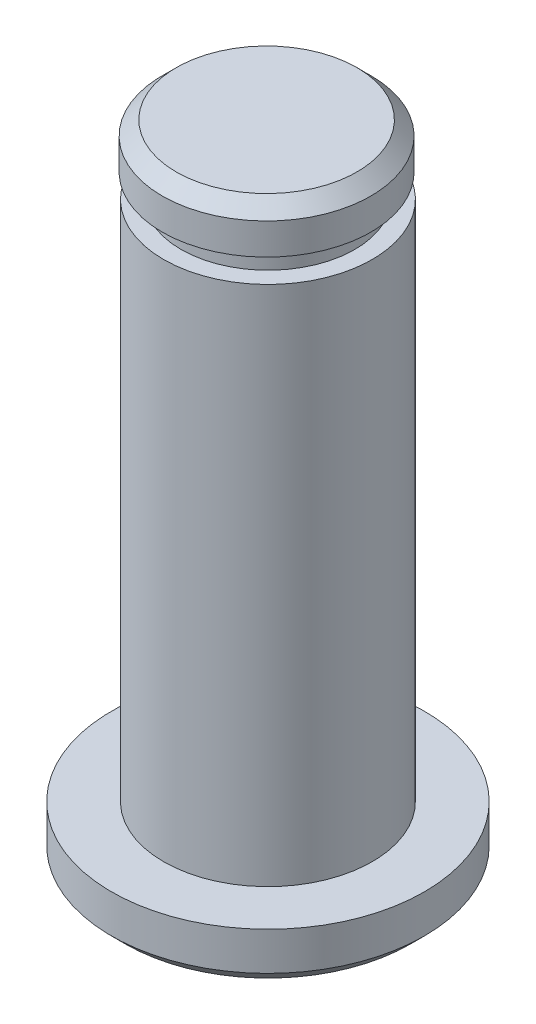
ISO-10303-21;
HEADER;
FILE_DESCRIPTION(('STEP AP214'),'2;1');
FILE_NAME('part.step','',(''),(''),'','','');
FILE_SCHEMA(('AUTOMOTIVE_DESIGN { 1 0 10303 214 1 1 1 1 }'));
ENDSEC;
DATA;
#1=APPLICATION_CONTEXT('core data for automotive mechanical design processes');
#2=APPLICATION_PROTOCOL_DEFINITION('international standard','automotive_design',2000,#1);
#3=PRODUCT_CONTEXT('',#1,'mechanical');
#4=PRODUCT('Part','Part','',(#3));
#5=PRODUCT_RELATED_PRODUCT_CATEGORY('part','',(#4));
#6=PRODUCT_DEFINITION_FORMATION('','',#4);
#7=PRODUCT_DEFINITION_CONTEXT('part definition',#1,'design');
#8=PRODUCT_DEFINITION('design','',#6,#7);
#9=PRODUCT_DEFINITION_SHAPE('','',#8);
#10=(LENGTH_UNIT() NAMED_UNIT(*) SI_UNIT(.MILLI.,.METRE.));
#11=(NAMED_UNIT(*) PLANE_ANGLE_UNIT() SI_UNIT($,.RADIAN.));
#12=(NAMED_UNIT(*) SI_UNIT($,.STERADIAN.) SOLID_ANGLE_UNIT());
#13=UNCERTAINTY_MEASURE_WITH_UNIT(LENGTH_MEASURE(1.E-05),#10,'distance_accuracy_value','');
#14=(GEOMETRIC_REPRESENTATION_CONTEXT(3) GLOBAL_UNCERTAINTY_ASSIGNED_CONTEXT((#13)) GLOBAL_UNIT_ASSIGNED_CONTEXT((#10,
#11,#12)) REPRESENTATION_CONTEXT('',''));
#15=CARTESIAN_POINT('',(0.,0.,0.));
#16=DIRECTION('',(0.,0.,1.));
#17=DIRECTION('',(1.,0.,0.));
#18=AXIS2_PLACEMENT_3D('',#15,#16,#17);
#19=CARTESIAN_POINT('',(0.,18.1,0.038502673796736));
#20=DIRECTION('',(0.,-1.,0.));
#21=DIRECTION('',(0.,0.,1.));
#22=AXIS2_PLACEMENT_3D('',#19,#20,#21);
#23=CONICAL_SURFACE('',#22,3.,0.785398163397447);
#24=CARTESIAN_POINT('',(0.,18.1,0.038502673796736));
#25=DIRECTION('',(0.,1.,0.));
#26=DIRECTION('',(0.,0.,1.));
#27=AXIS2_PLACEMENT_3D('',#24,#25,#26);
#28=CIRCLE('',#27,3.);
#29=CARTESIAN_POINT('',(0.,18.1,3.03850267379674));
#30=VERTEX_POINT('',#29);
#31=EDGE_CURVE('E91',#30,#30,#28,.T.);
#32=ORIENTED_EDGE('',*,*,#31,.T.);
#33=EDGE_LOOP('',(#32));
#34=FACE_BOUND('',#33,.T.);
#35=CARTESIAN_POINT('',(0.,18.5,0.038502673796736));
#36=DIRECTION('',(0.,-1.,0.));
#37=DIRECTION('',(0.,0.,1.));
#38=AXIS2_PLACEMENT_3D('',#35,#36,#37);
#39=CIRCLE('',#38,2.6);
#40=CARTESIAN_POINT('',(0.,18.5,2.63850267379674));
#41=VERTEX_POINT('',#40);
#42=EDGE_CURVE('E11',#41,#41,#39,.T.);
#43=ORIENTED_EDGE('',*,*,#42,.T.);
#44=EDGE_LOOP('',(#43));
#45=FACE_BOUND('',#44,.T.);
#46=ADVANCED_FACE('F41',(#34,#45),#23,.T.);
#47=CARTESIAN_POINT('',(0.,0.4,0.));
#48=DIRECTION('',(0.,1.,0.));
#49=DIRECTION('',(0.,0.,-1.));
#50=AXIS2_PLACEMENT_3D('',#47,#48,#49);
#51=CONICAL_SURFACE('',#50,4.5,0.785398163397449);
#52=CARTESIAN_POINT('',(0.,0.4,0.));
#53=DIRECTION('',(0.,-1.,0.));
#54=DIRECTION('',(0.,0.,-1.));
#55=AXIS2_PLACEMENT_3D('',#52,#53,#54);
#56=CIRCLE('',#55,4.5);
#57=CARTESIAN_POINT('',(0.,0.4,-4.5));
#58=VERTEX_POINT('',#57);
#59=EDGE_CURVE('E99',#58,#58,#56,.T.);
#60=ORIENTED_EDGE('',*,*,#59,.T.);
#61=EDGE_LOOP('',(#60));
#62=FACE_BOUND('',#61,.T.);
#63=CARTESIAN_POINT('',(0.,0.,0.));
#64=DIRECTION('',(0.,1.,0.));
#65=DIRECTION('',(0.,0.,-1.));
#66=AXIS2_PLACEMENT_3D('',#63,#64,#65);
#67=CIRCLE('',#66,4.1);
#68=CARTESIAN_POINT('',(0.,0.,-4.1));
#69=VERTEX_POINT('',#68);
#70=EDGE_CURVE('E76',#69,#69,#67,.T.);
#71=ORIENTED_EDGE('',*,*,#70,.T.);
#72=EDGE_LOOP('',(#71));
#73=FACE_BOUND('',#72,.T.);
#74=ADVANCED_FACE('F124',(#62,#73),#51,.T.);
#75=CARTESIAN_POINT('',(0.,17.2,0.038502673796736));
#76=DIRECTION('',(0.,-1.,0.));
#77=DIRECTION('',(0.,0.,1.));
#78=AXIS2_PLACEMENT_3D('',#75,#76,#77);
#79=PLANE('',#78);
#80=CARTESIAN_POINT('',(0.,17.2,0.038502673796736));
#81=DIRECTION('',(0.,1.,0.));
#82=DIRECTION('',(0.,0.,1.));
#83=AXIS2_PLACEMENT_3D('',#80,#81,#82);
#84=CIRCLE('',#83,3.);
#85=CARTESIAN_POINT('',(0.,17.2,3.03850267379674));
#86=VERTEX_POINT('',#85);
#87=EDGE_CURVE('E50',#86,#86,#84,.T.);
#88=ORIENTED_EDGE('',*,*,#87,.F.);
#89=EDGE_LOOP('',(#88));
#90=FACE_BOUND('',#89,.T.);
#91=CARTESIAN_POINT('',(0.,17.2,0.));
#92=DIRECTION('',(0.,1.,0.));
#93=DIRECTION('',(0.,0.,1.));
#94=AXIS2_PLACEMENT_3D('',#91,#92,#93);
#95=CIRCLE('',#94,2.5);
#96=CARTESIAN_POINT('',(0.,17.2,2.5));
#97=VERTEX_POINT('',#96);
#98=EDGE_CURVE('E87',#97,#97,#95,.T.);
#99=ORIENTED_EDGE('',*,*,#98,.T.);
#100=EDGE_LOOP('',(#99));
#101=FACE_BOUND('',#100,.T.);
#102=ADVANCED_FACE('F128',(#90,#101),#79,.T.);
#103=CARTESIAN_POINT('',(0.,18.5,0.038502673796736));
#104=DIRECTION('',(0.,-1.,0.));
#105=DIRECTION('',(0.,0.,1.));
#106=AXIS2_PLACEMENT_3D('',#103,#104,#105);
#107=PLANE('',#106);
#108=ORIENTED_EDGE('',*,*,#42,.F.);
#109=EDGE_LOOP('',(#108));
#110=FACE_BOUND('',#109,.T.);
#111=ADVANCED_FACE('F134',(#110),#107,.F.);
#112=CARTESIAN_POINT('',(0.,18.5,0.038502673796736));
#113=DIRECTION('',(0.,-1.,0.));
#114=DIRECTION('',(0.,0.,1.));
#115=AXIS2_PLACEMENT_3D('',#112,#113,#114);
#116=CYLINDRICAL_SURFACE('',#115,3.);
#117=ORIENTED_EDGE('',*,*,#87,.T.);
#118=EDGE_LOOP('',(#117));
#119=FACE_BOUND('',#118,.T.);
#120=ORIENTED_EDGE('',*,*,#31,.F.);
#121=EDGE_LOOP('',(#120));
#122=FACE_BOUND('',#121,.T.);
#123=ADVANCED_FACE('F151',(#119,#122),#116,.T.);
#124=CARTESIAN_POINT('',(0.,17.2,0.));
#125=DIRECTION('',(0.,-1.,0.));
#126=DIRECTION('',(0.,0.,1.));
#127=AXIS2_PLACEMENT_3D('',#124,#125,#126);
#128=CYLINDRICAL_SURFACE('',#127,2.5);
#129=CARTESIAN_POINT('',(0.,16.5,0.));
#130=DIRECTION('',(0.,1.,0.));
#131=DIRECTION('',(0.,0.,1.));
#132=AXIS2_PLACEMENT_3D('',#129,#130,#131);
#133=CIRCLE('',#132,2.5);
#134=CARTESIAN_POINT('',(0.,16.5,2.5));
#135=VERTEX_POINT('',#134);
#136=EDGE_CURVE('E44',#135,#135,#133,.T.);
#137=ORIENTED_EDGE('',*,*,#136,.T.);
#138=EDGE_LOOP('',(#137));
#139=FACE_BOUND('',#138,.T.);
#140=ORIENTED_EDGE('',*,*,#98,.F.);
#141=EDGE_LOOP('',(#140));
#142=FACE_BOUND('',#141,.T.);
#143=ADVANCED_FACE('F143',(#139,#142),#128,.T.);
#144=CARTESIAN_POINT('',(0.,16.5,0.));
#145=DIRECTION('',(0.,-1.,0.));
#146=DIRECTION('',(0.,0.,1.));
#147=AXIS2_PLACEMENT_3D('',#144,#145,#146);
#148=PLANE('',#147);
#149=CARTESIAN_POINT('',(0.,16.5,0.));
#150=DIRECTION('',(0.,1.,0.));
#151=DIRECTION('',(0.,0.,1.));
#152=AXIS2_PLACEMENT_3D('',#149,#150,#151);
#153=CIRCLE('',#152,3.);
#154=CARTESIAN_POINT('',(0.,16.5,3.));
#155=VERTEX_POINT('',#154);
#156=EDGE_CURVE('E98',#155,#155,#153,.T.);
#157=ORIENTED_EDGE('',*,*,#156,.T.);
#158=EDGE_LOOP('',(#157));
#159=FACE_BOUND('',#158,.T.);
#160=ORIENTED_EDGE('',*,*,#136,.F.);
#161=EDGE_LOOP('',(#160));
#162=FACE_BOUND('',#161,.T.);
#163=ADVANCED_FACE('F139',(#159,#162),#148,.F.);
#164=CARTESIAN_POINT('',(0.,16.5,0.));
#165=DIRECTION('',(0.,-1.,0.));
#166=DIRECTION('',(0.,0.,1.));
#167=AXIS2_PLACEMENT_3D('',#164,#165,#166);
#168=CYLINDRICAL_SURFACE('',#167,3.);
#169=CARTESIAN_POINT('',(0.,1.5,0.));
#170=DIRECTION('',(0.,1.,0.));
#171=DIRECTION('',(0.,0.,1.));
#172=AXIS2_PLACEMENT_3D('',#169,#170,#171);
#173=CIRCLE('',#172,3.);
#174=CARTESIAN_POINT('',(0.,1.5,3.));
#175=VERTEX_POINT('',#174);
#176=EDGE_CURVE('E70',#175,#175,#173,.T.);
#177=ORIENTED_EDGE('',*,*,#176,.T.);
#178=EDGE_LOOP('',(#177));
#179=FACE_BOUND('',#178,.T.);
#180=ORIENTED_EDGE('',*,*,#156,.F.);
#181=EDGE_LOOP('',(#180));
#182=FACE_BOUND('',#181,.T.);
#183=ADVANCED_FACE('F118',(#179,#182),#168,.T.);
#184=CARTESIAN_POINT('',(0.,0.,0.));
#185=DIRECTION('',(0.,1.,0.));
#186=DIRECTION('',(1.,0.,0.));
#187=AXIS2_PLACEMENT_3D('',#184,#185,#186);
#188=PLANE('',#187);
#189=ORIENTED_EDGE('',*,*,#70,.F.);
#190=EDGE_LOOP('',(#189));
#191=FACE_BOUND('',#190,.T.);
#192=ADVANCED_FACE('F112',(#191),#188,.F.);
#193=CARTESIAN_POINT('',(0.,1.5,0.));
#194=DIRECTION('',(0.,1.,0.));
#195=DIRECTION('',(1.,0.,0.));
#196=AXIS2_PLACEMENT_3D('',#193,#194,#195);
#197=PLANE('',#196);
#198=CARTESIAN_POINT('',(0.,1.5,0.));
#199=DIRECTION('',(0.,-1.,0.));
#200=DIRECTION('',(1.,0.,0.));
#201=AXIS2_PLACEMENT_3D('',#198,#199,#200);
#202=CIRCLE('',#201,4.5);
#203=CARTESIAN_POINT('',(4.5,1.5,0.));
#204=VERTEX_POINT('',#203);
#205=EDGE_CURVE('E101',#204,#204,#202,.T.);
#206=ORIENTED_EDGE('',*,*,#205,.F.);
#207=EDGE_LOOP('',(#206));
#208=FACE_BOUND('',#207,.T.);
#209=ORIENTED_EDGE('',*,*,#176,.F.);
#210=EDGE_LOOP('',(#209));
#211=FACE_BOUND('',#210,.T.);
#212=ADVANCED_FACE('F109',(#208,#211),#197,.T.);
#213=CARTESIAN_POINT('',(0.,1.5,0.));
#214=DIRECTION('',(0.,-1.,0.));
#215=DIRECTION('',(0.,0.,1.));
#216=AXIS2_PLACEMENT_3D('',#213,#214,#215);
#217=CYLINDRICAL_SURFACE('',#216,4.5);
#218=ORIENTED_EDGE('',*,*,#205,.T.);
#219=EDGE_LOOP('',(#218));
#220=FACE_BOUND('',#219,.T.);
#221=ORIENTED_EDGE('',*,*,#59,.F.);
#222=EDGE_LOOP('',(#221));
#223=FACE_BOUND('',#222,.T.);
#224=ADVANCED_FACE('F106',(#220,#223),#217,.T.);
#225=CLOSED_SHELL('',(#46,#74,#102,#111,#123,#143,#163,#183,#192,#212,#224));
#226=MANIFOLD_SOLID_BREP('B2',#225);
#227=ADVANCED_BREP_SHAPE_REPRESENTATION('',(#18,#226),#14);
#228=SHAPE_DEFINITION_REPRESENTATION(#9,#227);
ENDSEC;
END-ISO-10303-21;
